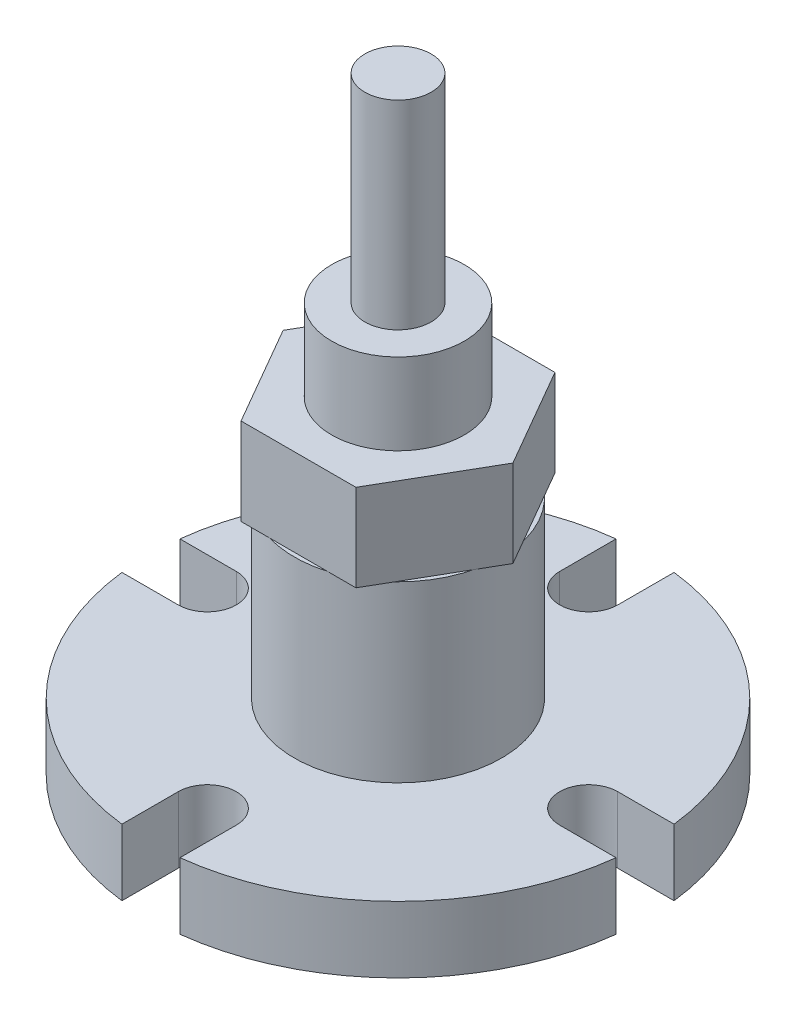
ISO-10303-21;
HEADER;
FILE_DESCRIPTION(('STEP AP214'),'2;1');
FILE_NAME('part.step','',(''),(''),'','','');
FILE_SCHEMA(('AUTOMOTIVE_DESIGN { 1 0 10303 214 1 1 1 1 }'));
ENDSEC;
DATA;
#1=APPLICATION_CONTEXT('core data for automotive mechanical design processes');
#2=APPLICATION_PROTOCOL_DEFINITION('international standard','automotive_design',2000,#1);
#3=PRODUCT_CONTEXT('',#1,'mechanical');
#4=PRODUCT('Part','Part','',(#3));
#5=PRODUCT_RELATED_PRODUCT_CATEGORY('part','',(#4));
#6=PRODUCT_DEFINITION_FORMATION('','',#4);
#7=PRODUCT_DEFINITION_CONTEXT('part definition',#1,'design');
#8=PRODUCT_DEFINITION('design','',#6,#7);
#9=PRODUCT_DEFINITION_SHAPE('','',#8);
#10=(LENGTH_UNIT() NAMED_UNIT(*) SI_UNIT(.MILLI.,.METRE.));
#11=(NAMED_UNIT(*) PLANE_ANGLE_UNIT() SI_UNIT($,.RADIAN.));
#12=(NAMED_UNIT(*) SI_UNIT($,.STERADIAN.) SOLID_ANGLE_UNIT());
#13=UNCERTAINTY_MEASURE_WITH_UNIT(LENGTH_MEASURE(1.E-05),#10,'distance_accuracy_value','');
#14=(GEOMETRIC_REPRESENTATION_CONTEXT(3) GLOBAL_UNCERTAINTY_ASSIGNED_CONTEXT((#13)) GLOBAL_UNIT_ASSIGNED_CONTEXT((#10,
#11,#12)) REPRESENTATION_CONTEXT('',''));
#15=CARTESIAN_POINT('',(0.,0.,0.));
#16=DIRECTION('',(0.,0.,1.));
#17=DIRECTION('',(1.,0.,0.));
#18=AXIS2_PLACEMENT_3D('',#15,#16,#17);
#19=CARTESIAN_POINT('',(0.,-55.3,0.));
#20=DIRECTION('',(0.,1.,0.));
#21=DIRECTION('',(0.,0.,1.));
#22=AXIS2_PLACEMENT_3D('',#19,#20,#21);
#23=CYLINDRICAL_SURFACE('',#22,15.25);
#24=CARTESIAN_POINT('',(0.,-51.3,0.));
#25=DIRECTION('',(0.,1.,0.));
#26=DIRECTION('',(0.,0.,1.));
#27=AXIS2_PLACEMENT_3D('',#24,#25,#26);
#28=CIRCLE('',#27,15.25);
#29=CARTESIAN_POINT('',(0.,-51.3,15.25));
#30=VERTEX_POINT('',#29);
#31=EDGE_CURVE('P0_E146',#30,#30,#28,.T.);
#32=ORIENTED_EDGE('',*,*,#31,.T.);
#33=EDGE_LOOP('',(#32));
#34=FACE_BOUND('',#33,.T.);
#35=CARTESIAN_POINT('',(0.,-55.3,0.));
#36=DIRECTION('',(0.,1.,0.));
#37=DIRECTION('',(0.,0.,1.));
#38=AXIS2_PLACEMENT_3D('',#35,#36,#37);
#39=CIRCLE('',#38,15.25);
#40=CARTESIAN_POINT('',(0.,-55.3,15.25));
#41=VERTEX_POINT('',#40);
#42=EDGE_CURVE('P0_E19',#41,#41,#39,.F.);
#43=ORIENTED_EDGE('',*,*,#42,.T.);
#44=EDGE_LOOP('',(#43));
#45=FACE_BOUND('',#44,.T.);
#46=ADVANCED_FACE('P0_F16',(#34,#45),#23,.F.);
#47=CARTESIAN_POINT('',(0.,-55.3,0.));
#48=DIRECTION('',(0.,1.,0.));
#49=DIRECTION('',(0.,0.,1.));
#50=AXIS2_PLACEMENT_3D('',#47,#48,#49);
#51=PLANE('',#50);
#52=DIRECTION('',(0.,0.,-1.));
#53=VECTOR('',#52,1.);
#54=CARTESIAN_POINT('',(3.49999999999976,-55.3,-23.));
#55=LINE('',#54,#53);
#56=CARTESIAN_POINT('',(3.49999999999976,-55.3,-23.));
#57=VERTEX_POINT('',#56);
#58=CARTESIAN_POINT('',(3.49999999999969,-55.3,-29.7951338308792));
#59=VERTEX_POINT('',#58);
#60=EDGE_CURVE('P0_E133',#57,#59,#55,.T.);
#61=ORIENTED_EDGE('',*,*,#60,.T.);
#62=CARTESIAN_POINT('',(0.,-55.3,0.));
#63=DIRECTION('',(0.,1.,0.));
#64=DIRECTION('',(0.,0.,1.));
#65=AXIS2_PLACEMENT_3D('',#62,#63,#64);
#66=CIRCLE('',#65,30.);
#67=CARTESIAN_POINT('',(29.7951338308792,-55.3,-3.5));
#68=VERTEX_POINT('',#67);
#69=EDGE_CURVE('P0_E216',#68,#59,#66,.T.);
#70=ORIENTED_EDGE('',*,*,#69,.F.);
#71=DIRECTION('',(-1.,0.,0.));
#72=VECTOR('',#71,1.);
#73=CARTESIAN_POINT('',(23.,-55.3,-3.5));
#74=LINE('',#73,#72);
#75=CARTESIAN_POINT('',(23.,-55.3,-3.5));
#76=VERTEX_POINT('',#75);
#77=EDGE_CURVE('P0_E158',#68,#76,#74,.T.);
#78=ORIENTED_EDGE('',*,*,#77,.T.);
#79=CARTESIAN_POINT('',(23.,-55.3,0.));
#80=DIRECTION('',(0.,-1.,0.));
#81=DIRECTION('',(0.,0.,-1.));
#82=AXIS2_PLACEMENT_3D('',#79,#80,#81);
#83=CIRCLE('',#82,3.5);
#84=CARTESIAN_POINT('',(23.,-55.3,3.5));
#85=VERTEX_POINT('',#84);
#86=EDGE_CURVE('P0_E165',#76,#85,#83,.F.);
#87=ORIENTED_EDGE('',*,*,#86,.T.);
#88=DIRECTION('',(1.,0.,0.));
#89=VECTOR('',#88,1.);
#90=CARTESIAN_POINT('',(23.,-55.3,3.5));
#91=LINE('',#90,#89);
#92=CARTESIAN_POINT('',(29.7951338308792,-55.3,3.5));
#93=VERTEX_POINT('',#92);
#94=EDGE_CURVE('P0_E162',#85,#93,#91,.T.);
#95=ORIENTED_EDGE('',*,*,#94,.T.);
#96=CARTESIAN_POINT('',(0.,-55.3,0.));
#97=DIRECTION('',(0.,1.,0.));
#98=DIRECTION('',(0.,0.,1.));
#99=AXIS2_PLACEMENT_3D('',#96,#97,#98);
#100=CIRCLE('',#99,30.);
#101=CARTESIAN_POINT('',(3.5000000000001,-55.3,29.7951338308792));
#102=VERTEX_POINT('',#101);
#103=EDGE_CURVE('P0_E219',#102,#93,#100,.T.);
#104=ORIENTED_EDGE('',*,*,#103,.F.);
#105=DIRECTION('',(0.,0.,-1.));
#106=VECTOR('',#105,1.);
#107=CARTESIAN_POINT('',(3.50000000000008,-55.3,23.));
#108=LINE('',#107,#106);
#109=CARTESIAN_POINT('',(3.50000000000008,-55.3,23.));
#110=VERTEX_POINT('',#109);
#111=EDGE_CURVE('P0_E167',#102,#110,#108,.T.);
#112=ORIENTED_EDGE('',*,*,#111,.T.);
#113=CARTESIAN_POINT('',(0.,-55.3,23.));
#114=DIRECTION('',(0.,-1.,0.));
#115=DIRECTION('',(0.,0.,-1.));
#116=AXIS2_PLACEMENT_3D('',#113,#114,#115);
#117=CIRCLE('',#116,3.5);
#118=CARTESIAN_POINT('',(-3.49999999999992,-55.3,23.));
#119=VERTEX_POINT('',#118);
#120=EDGE_CURVE('P0_E170',#110,#119,#117,.F.);
#121=ORIENTED_EDGE('',*,*,#120,.T.);
#122=DIRECTION('',(0.,0.,1.));
#123=VECTOR('',#122,1.);
#124=CARTESIAN_POINT('',(-3.49999999999992,-55.3,23.));
#125=LINE('',#124,#123);
#126=CARTESIAN_POINT('',(-3.4999999999999,-55.3,29.7951338308792));
#127=VERTEX_POINT('',#126);
#128=EDGE_CURVE('P0_E171',#119,#127,#125,.T.);
#129=ORIENTED_EDGE('',*,*,#128,.T.);
#130=CARTESIAN_POINT('',(0.,-55.3,0.));
#131=DIRECTION('',(0.,1.,0.));
#132=DIRECTION('',(0.,0.,1.));
#133=AXIS2_PLACEMENT_3D('',#130,#131,#132);
#134=CIRCLE('',#133,30.);
#135=CARTESIAN_POINT('',(-29.7951338308792,-55.3,3.5));
#136=VERTEX_POINT('',#135);
#137=EDGE_CURVE('P0_E223',#136,#127,#134,.T.);
#138=ORIENTED_EDGE('',*,*,#137,.F.);
#139=DIRECTION('',(1.,0.,0.));
#140=VECTOR('',#139,1.);
#141=CARTESIAN_POINT('',(-23.,-55.3,3.5));
#142=LINE('',#141,#140);
#143=CARTESIAN_POINT('',(-23.,-55.3,3.5));
#144=VERTEX_POINT('',#143);
#145=EDGE_CURVE('P0_E176',#136,#144,#142,.T.);
#146=ORIENTED_EDGE('',*,*,#145,.T.);
#147=CARTESIAN_POINT('',(-23.,-55.3,0.));
#148=DIRECTION('',(0.,-1.,0.));
#149=DIRECTION('',(0.,0.,-1.));
#150=AXIS2_PLACEMENT_3D('',#147,#148,#149);
#151=CIRCLE('',#150,3.5);
#152=CARTESIAN_POINT('',(-23.,-55.3,-3.5));
#153=VERTEX_POINT('',#152);
#154=EDGE_CURVE('P0_E182',#144,#153,#151,.F.);
#155=ORIENTED_EDGE('',*,*,#154,.T.);
#156=DIRECTION('',(-1.,0.,0.));
#157=VECTOR('',#156,1.);
#158=CARTESIAN_POINT('',(-23.,-55.3,-3.5));
#159=LINE('',#158,#157);
#160=CARTESIAN_POINT('',(-29.7951338308792,-55.3,-3.5));
#161=VERTEX_POINT('',#160);
#162=EDGE_CURVE('P0_E180',#153,#161,#159,.T.);
#163=ORIENTED_EDGE('',*,*,#162,.T.);
#164=CARTESIAN_POINT('',(0.,-55.3,0.));
#165=DIRECTION('',(0.,1.,0.));
#166=DIRECTION('',(0.,0.,1.));
#167=AXIS2_PLACEMENT_3D('',#164,#165,#166);
#168=CIRCLE('',#167,30.);
#169=CARTESIAN_POINT('',(-3.50000000000031,-55.3,-29.7951338308791));
#170=VERTEX_POINT('',#169);
#171=EDGE_CURVE('P0_E227',#170,#161,#168,.T.);
#172=ORIENTED_EDGE('',*,*,#171,.F.);
#173=DIRECTION('',(0.,0.,1.));
#174=VECTOR('',#173,1.);
#175=CARTESIAN_POINT('',(-3.50000000000024,-55.3,-23.));
#176=LINE('',#175,#174);
#177=CARTESIAN_POINT('',(-3.50000000000024,-55.3,-23.));
#178=VERTEX_POINT('',#177);
#179=EDGE_CURVE('P0_E126',#170,#178,#176,.T.);
#180=ORIENTED_EDGE('',*,*,#179,.T.);
#181=CARTESIAN_POINT('',(-2.40912212380176E-13,-55.3,-23.));
#182=DIRECTION('',(0.,-1.,0.));
#183=DIRECTION('',(0.,0.,-1.));
#184=AXIS2_PLACEMENT_3D('',#181,#182,#183);
#185=CIRCLE('',#184,3.5);
#186=EDGE_CURVE('P0_E128',#178,#57,#185,.F.);
#187=ORIENTED_EDGE('',*,*,#186,.T.);
#188=EDGE_LOOP('',(#61,#70,#78,#87,#95,#104,#112,#121,#129,#138,#146,#155,#163,#172,#180,#187));
#189=FACE_BOUND('',#188,.T.);
#190=ORIENTED_EDGE('',*,*,#42,.F.);
#191=EDGE_LOOP('',(#190));
#192=FACE_BOUND('',#191,.T.);
#193=ADVANCED_FACE('P0_F130',(#189,#192),#51,.F.);
#194=CARTESIAN_POINT('',(0.,-51.3,0.));
#195=DIRECTION('',(0.,1.,0.));
#196=DIRECTION('',(0.,0.,1.));
#197=AXIS2_PLACEMENT_3D('',#194,#195,#196);
#198=PLANE('',#197);
#199=ORIENTED_EDGE('',*,*,#31,.F.);
#200=EDGE_LOOP('',(#199));
#201=FACE_BOUND('',#200,.T.);
#202=CARTESIAN_POINT('',(0.,-51.3,0.));
#203=DIRECTION('',(0.,-1.,0.));
#204=DIRECTION('',(0.,0.,-1.));
#205=AXIS2_PLACEMENT_3D('',#202,#203,#204);
#206=CIRCLE('',#205,8.);
#207=CARTESIAN_POINT('',(0.,-51.3,-8.));
#208=VERTEX_POINT('',#207);
#209=EDGE_CURVE('P0_E213',#208,#208,#206,.F.);
#210=ORIENTED_EDGE('',*,*,#209,.T.);
#211=EDGE_LOOP('',(#210));
#212=FACE_BOUND('',#211,.T.);
#213=ADVANCED_FACE('P0_F236',(#201,#212),#198,.F.);
#214=CARTESIAN_POINT('',(3.49999999999976,-47.299,-23.));
#215=DIRECTION('',(1.,0.,0.));
#216=DIRECTION('',(0.,0.,-1.));
#217=AXIS2_PLACEMENT_3D('',#214,#215,#216);
#218=PLANE('',#217);
#219=DIRECTION('',(0.,-1.,0.));
#220=VECTOR('',#219,1.);
#221=CARTESIAN_POINT('',(3.49999999999976,-47.299,-23.));
#222=LINE('',#221,#220);
#223=CARTESIAN_POINT('',(3.49999999999972,-47.3,-23.));
#224=VERTEX_POINT('',#223);
#225=EDGE_CURVE('P0_E138',#57,#224,#222,.F.);
#226=ORIENTED_EDGE('',*,*,#225,.T.);
#227=DIRECTION('',(0.,0.,1.));
#228=VECTOR('',#227,1.);
#229=CARTESIAN_POINT('',(3.49999999999969,-47.3,0.));
#230=LINE('',#229,#228);
#231=CARTESIAN_POINT('',(3.49999999999969,-47.3,-29.7951338308792));
#232=VERTEX_POINT('',#231);
#233=EDGE_CURVE('P0_E212',#232,#224,#230,.T.);
#234=ORIENTED_EDGE('',*,*,#233,.F.);
#235=DIRECTION('',(0.,1.,0.));
#236=VECTOR('',#235,1.);
#237=CARTESIAN_POINT('',(3.49999999999969,-55.3,-29.7951338308792));
#238=LINE('',#237,#236);
#239=EDGE_CURVE('P0_E144',#59,#232,#238,.T.);
#240=ORIENTED_EDGE('',*,*,#239,.F.);
#241=ORIENTED_EDGE('',*,*,#60,.F.);
#242=EDGE_LOOP('',(#226,#234,#240,#241));
#243=FACE_BOUND('',#242,.T.);
#244=ADVANCED_FACE('P0_F141',(#243),#218,.F.);
#245=CARTESIAN_POINT('',(-2.40912212380176E-13,-47.299,-23.));
#246=DIRECTION('',(0.,-1.,0.));
#247=DIRECTION('',(0.,0.,-1.));
#248=AXIS2_PLACEMENT_3D('',#245,#246,#247);
#249=CYLINDRICAL_SURFACE('',#248,3.5);
#250=ORIENTED_EDGE('',*,*,#186,.F.);
#251=DIRECTION('',(0.,1.,0.));
#252=VECTOR('',#251,1.);
#253=CARTESIAN_POINT('',(-3.50000000000024,-47.299,-23.));
#254=LINE('',#253,#252);
#255=CARTESIAN_POINT('',(-3.50000000000024,-47.3,-23.));
#256=VERTEX_POINT('',#255);
#257=EDGE_CURVE('P0_E153',#178,#256,#254,.T.);
#258=ORIENTED_EDGE('',*,*,#257,.T.);
#259=CARTESIAN_POINT('',(-2.40912212380176E-13,-47.3,-23.));
#260=DIRECTION('',(0.,-1.,0.));
#261=DIRECTION('',(0.,0.,-1.));
#262=AXIS2_PLACEMENT_3D('',#259,#260,#261);
#263=CIRCLE('',#262,3.5);
#264=EDGE_CURVE('P0_E150',#224,#256,#263,.T.);
#265=ORIENTED_EDGE('',*,*,#264,.F.);
#266=ORIENTED_EDGE('',*,*,#225,.F.);
#267=EDGE_LOOP('',(#250,#258,#265,#266));
#268=FACE_BOUND('',#267,.T.);
#269=ADVANCED_FACE('P0_F148',(#268),#249,.F.);
#270=CARTESIAN_POINT('',(-3.50000000000024,-47.299,-23.));
#271=DIRECTION('',(-1.,0.,0.));
#272=DIRECTION('',(0.,0.,1.));
#273=AXIS2_PLACEMENT_3D('',#270,#271,#272);
#274=PLANE('',#273);
#275=ORIENTED_EDGE('',*,*,#257,.F.);
#276=ORIENTED_EDGE('',*,*,#179,.F.);
#277=DIRECTION('',(0.,1.,0.));
#278=VECTOR('',#277,1.);
#279=CARTESIAN_POINT('',(-3.5000000000003,-55.3,-29.7951338308791));
#280=LINE('',#279,#278);
#281=CARTESIAN_POINT('',(-3.50000000000027,-47.3,-29.7951338308791));
#282=VERTEX_POINT('',#281);
#283=EDGE_CURVE('P0_E228',#282,#170,#280,.F.);
#284=ORIENTED_EDGE('',*,*,#283,.F.);
#285=DIRECTION('',(0.,0.,1.));
#286=VECTOR('',#285,1.);
#287=CARTESIAN_POINT('',(-3.50000000000024,-47.3,0.));
#288=LINE('',#287,#286);
#289=EDGE_CURVE('P0_E210',#256,#282,#288,.F.);
#290=ORIENTED_EDGE('',*,*,#289,.F.);
#291=EDGE_LOOP('',(#275,#276,#284,#290));
#292=FACE_BOUND('',#291,.T.);
#293=ADVANCED_FACE('P0_F307',(#292),#274,.F.);
#294=CARTESIAN_POINT('',(0.,-55.3,0.));
#295=DIRECTION('',(0.,1.,0.));
#296=DIRECTION('',(0.,0.,1.));
#297=AXIS2_PLACEMENT_3D('',#294,#295,#296);
#298=CYLINDRICAL_SURFACE('',#297,30.);
#299=DIRECTION('',(0.,1.,0.));
#300=VECTOR('',#299,1.);
#301=CARTESIAN_POINT('',(-29.7951338308792,0.001000000000001,-3.5));
#302=LINE('',#301,#300);
#303=CARTESIAN_POINT('',(-29.7951338308792,-47.3,-3.5));
#304=VERTEX_POINT('',#303);
#305=EDGE_CURVE('P0_E183',#161,#304,#302,.T.);
#306=ORIENTED_EDGE('',*,*,#305,.T.);
#307=CARTESIAN_POINT('',(0.,-47.3,0.));
#308=DIRECTION('',(0.,1.,0.));
#309=DIRECTION('',(0.,0.,1.));
#310=AXIS2_PLACEMENT_3D('',#307,#308,#309);
#311=CIRCLE('',#310,30.);
#312=EDGE_CURVE('P0_E207',#282,#304,#311,.T.);
#313=ORIENTED_EDGE('',*,*,#312,.F.);
#314=ORIENTED_EDGE('',*,*,#283,.T.);
#315=ORIENTED_EDGE('',*,*,#171,.T.);
#316=EDGE_LOOP('',(#306,#313,#314,#315));
#317=FACE_BOUND('',#316,.T.);
#318=ADVANCED_FACE('P0_F303',(#317),#298,.T.);
#319=CARTESIAN_POINT('',(-23.,0.001000000000001,-3.5));
#320=DIRECTION('',(0.,0.,-1.));
#321=DIRECTION('',(-1.,0.,0.));
#322=AXIS2_PLACEMENT_3D('',#319,#320,#321);
#323=PLANE('',#322);
#324=DIRECTION('',(0.,-1.,0.));
#325=VECTOR('',#324,1.);
#326=CARTESIAN_POINT('',(-23.,0.001000000000001,-3.5));
#327=LINE('',#326,#325);
#328=CARTESIAN_POINT('',(-23.,-47.3,-3.5));
#329=VERTEX_POINT('',#328);
#330=EDGE_CURVE('P0_E179',#153,#329,#327,.F.);
#331=ORIENTED_EDGE('',*,*,#330,.T.);
#332=DIRECTION('',(1.,0.,0.));
#333=VECTOR('',#332,1.);
#334=CARTESIAN_POINT('',(0.,-47.3,-3.5));
#335=LINE('',#334,#333);
#336=EDGE_CURVE('P0_E206',#304,#329,#335,.T.);
#337=ORIENTED_EDGE('',*,*,#336,.F.);
#338=ORIENTED_EDGE('',*,*,#305,.F.);
#339=ORIENTED_EDGE('',*,*,#162,.F.);
#340=EDGE_LOOP('',(#331,#337,#338,#339));
#341=FACE_BOUND('',#340,.T.);
#342=ADVANCED_FACE('P0_F299',(#341),#323,.F.);
#343=CARTESIAN_POINT('',(-23.,0.001000000000001,0.));
#344=DIRECTION('',(0.,-1.,0.));
#345=DIRECTION('',(0.,0.,-1.));
#346=AXIS2_PLACEMENT_3D('',#343,#344,#345);
#347=CYLINDRICAL_SURFACE('',#346,3.5);
#348=ORIENTED_EDGE('',*,*,#154,.F.);
#349=DIRECTION('',(0.,1.,0.));
#350=VECTOR('',#349,1.);
#351=CARTESIAN_POINT('',(-23.,0.001000000000001,3.5));
#352=LINE('',#351,#350);
#353=CARTESIAN_POINT('',(-23.,-47.3,3.5));
#354=VERTEX_POINT('',#353);
#355=EDGE_CURVE('P0_E178',#144,#354,#352,.T.);
#356=ORIENTED_EDGE('',*,*,#355,.T.);
#357=CARTESIAN_POINT('',(-23.,-47.3,0.));
#358=DIRECTION('',(0.,-1.,0.));
#359=DIRECTION('',(0.,0.,-1.));
#360=AXIS2_PLACEMENT_3D('',#357,#358,#359);
#361=CIRCLE('',#360,3.5);
#362=EDGE_CURVE('P0_E203',#329,#354,#361,.T.);
#363=ORIENTED_EDGE('',*,*,#362,.F.);
#364=ORIENTED_EDGE('',*,*,#330,.F.);
#365=EDGE_LOOP('',(#348,#356,#363,#364));
#366=FACE_BOUND('',#365,.T.);
#367=ADVANCED_FACE('P0_F295',(#366),#347,.F.);
#368=CARTESIAN_POINT('',(-23.,0.001000000000001,3.5));
#369=DIRECTION('',(0.,0.,1.));
#370=DIRECTION('',(1.,0.,0.));
#371=AXIS2_PLACEMENT_3D('',#368,#369,#370);
#372=PLANE('',#371);
#373=ORIENTED_EDGE('',*,*,#355,.F.);
#374=ORIENTED_EDGE('',*,*,#145,.F.);
#375=DIRECTION('',(0.,1.,0.));
#376=VECTOR('',#375,1.);
#377=CARTESIAN_POINT('',(-29.7951338308792,-55.3,3.49999999999999));
#378=LINE('',#377,#376);
#379=CARTESIAN_POINT('',(-29.7951338308792,-47.3,3.5));
#380=VERTEX_POINT('',#379);
#381=EDGE_CURVE('P0_E225',#380,#136,#378,.F.);
#382=ORIENTED_EDGE('',*,*,#381,.F.);
#383=DIRECTION('',(1.,0.,0.));
#384=VECTOR('',#383,1.);
#385=CARTESIAN_POINT('',(0.,-47.3,3.5));
#386=LINE('',#385,#384);
#387=EDGE_CURVE('P0_E202',#354,#380,#386,.F.);
#388=ORIENTED_EDGE('',*,*,#387,.F.);
#389=EDGE_LOOP('',(#373,#374,#382,#388));
#390=FACE_BOUND('',#389,.T.);
#391=ADVANCED_FACE('P0_F291',(#390),#372,.F.);
#392=CARTESIAN_POINT('',(0.,-55.3,0.));
#393=DIRECTION('',(0.,1.,0.));
#394=DIRECTION('',(0.,0.,1.));
#395=AXIS2_PLACEMENT_3D('',#392,#393,#394);
#396=CYLINDRICAL_SURFACE('',#395,30.);
#397=ORIENTED_EDGE('',*,*,#381,.T.);
#398=ORIENTED_EDGE('',*,*,#137,.T.);
#399=DIRECTION('',(0.,1.,0.));
#400=VECTOR('',#399,1.);
#401=CARTESIAN_POINT('',(-3.4999999999999,-47.299,29.7951338308792));
#402=LINE('',#401,#400);
#403=CARTESIAN_POINT('',(-3.4999999999999,-47.3,29.7951338308792));
#404=VERTEX_POINT('',#403);
#405=EDGE_CURVE('P0_E175',#127,#404,#402,.T.);
#406=ORIENTED_EDGE('',*,*,#405,.T.);
#407=CARTESIAN_POINT('',(0.,-47.3,0.));
#408=DIRECTION('',(0.,1.,0.));
#409=DIRECTION('',(0.,0.,1.));
#410=AXIS2_PLACEMENT_3D('',#407,#408,#409);
#411=CIRCLE('',#410,30.);
#412=EDGE_CURVE('P0_E199',#380,#404,#411,.T.);
#413=ORIENTED_EDGE('',*,*,#412,.F.);
#414=EDGE_LOOP('',(#397,#398,#406,#413));
#415=FACE_BOUND('',#414,.T.);
#416=ADVANCED_FACE('P0_F287',(#415),#396,.T.);
#417=CARTESIAN_POINT('',(-3.49999999999992,-47.299,23.));
#418=DIRECTION('',(-1.,0.,0.));
#419=DIRECTION('',(0.,0.,1.));
#420=AXIS2_PLACEMENT_3D('',#417,#418,#419);
#421=PLANE('',#420);
#422=DIRECTION('',(0.,-1.,0.));
#423=VECTOR('',#422,1.);
#424=CARTESIAN_POINT('',(-3.49999999999992,-47.299,23.));
#425=LINE('',#424,#423);
#426=CARTESIAN_POINT('',(-3.49999999999991,-47.3,23.));
#427=VERTEX_POINT('',#426);
#428=EDGE_CURVE('P0_E174',#119,#427,#425,.F.);
#429=ORIENTED_EDGE('',*,*,#428,.T.);
#430=DIRECTION('',(0.,0.,1.));
#431=VECTOR('',#430,1.);
#432=CARTESIAN_POINT('',(-3.4999999999999,-47.3,0.));
#433=LINE('',#432,#431);
#434=EDGE_CURVE('P0_E198',#404,#427,#433,.F.);
#435=ORIENTED_EDGE('',*,*,#434,.F.);
#436=ORIENTED_EDGE('',*,*,#405,.F.);
#437=ORIENTED_EDGE('',*,*,#128,.F.);
#438=EDGE_LOOP('',(#429,#435,#436,#437));
#439=FACE_BOUND('',#438,.T.);
#440=ADVANCED_FACE('P0_F283',(#439),#421,.F.);
#441=CARTESIAN_POINT('',(0.,-47.299,23.));
#442=DIRECTION('',(0.,-1.,0.));
#443=DIRECTION('',(0.,0.,-1.));
#444=AXIS2_PLACEMENT_3D('',#441,#442,#443);
#445=CYLINDRICAL_SURFACE('',#444,3.5);
#446=DIRECTION('',(0.,1.,0.));
#447=VECTOR('',#446,1.);
#448=CARTESIAN_POINT('',(3.50000000000008,-47.299,23.));
#449=LINE('',#448,#447);
#450=CARTESIAN_POINT('',(3.50000000000008,-47.3,23.));
#451=VERTEX_POINT('',#450);
#452=EDGE_CURVE('P0_E169',#110,#451,#449,.T.);
#453=ORIENTED_EDGE('',*,*,#452,.T.);
#454=CARTESIAN_POINT('',(0.,-47.3,23.));
#455=DIRECTION('',(0.,-1.,0.));
#456=DIRECTION('',(0.,0.,-1.));
#457=AXIS2_PLACEMENT_3D('',#454,#455,#456);
#458=CIRCLE('',#457,3.5);
#459=EDGE_CURVE('P0_E196',#427,#451,#458,.T.);
#460=ORIENTED_EDGE('',*,*,#459,.F.);
#461=ORIENTED_EDGE('',*,*,#428,.F.);
#462=ORIENTED_EDGE('',*,*,#120,.F.);
#463=EDGE_LOOP('',(#453,#460,#461,#462));
#464=FACE_BOUND('',#463,.T.);
#465=ADVANCED_FACE('P0_F279',(#464),#445,.F.);
#466=CARTESIAN_POINT('',(3.50000000000008,-47.299,23.));
#467=DIRECTION('',(1.,0.,0.));
#468=DIRECTION('',(0.,0.,-1.));
#469=AXIS2_PLACEMENT_3D('',#466,#467,#468);
#470=PLANE('',#469);
#471=ORIENTED_EDGE('',*,*,#452,.F.);
#472=ORIENTED_EDGE('',*,*,#111,.F.);
#473=DIRECTION('',(0.,1.,0.));
#474=VECTOR('',#473,1.);
#475=CARTESIAN_POINT('',(3.5000000000001,-55.3,29.7951338308792));
#476=LINE('',#475,#474);
#477=CARTESIAN_POINT('',(3.50000000000009,-47.3,29.7951338308792));
#478=VERTEX_POINT('',#477);
#479=EDGE_CURVE('P0_E221',#478,#102,#476,.F.);
#480=ORIENTED_EDGE('',*,*,#479,.F.);
#481=DIRECTION('',(0.,0.,1.));
#482=VECTOR('',#481,1.);
#483=CARTESIAN_POINT('',(3.50000000000008,-47.3,0.));
#484=LINE('',#483,#482);
#485=EDGE_CURVE('P0_E195',#451,#478,#484,.T.);
#486=ORIENTED_EDGE('',*,*,#485,.F.);
#487=EDGE_LOOP('',(#471,#472,#480,#486));
#488=FACE_BOUND('',#487,.T.);
#489=ADVANCED_FACE('P0_F275',(#488),#470,.F.);
#490=CARTESIAN_POINT('',(0.,-55.3,0.));
#491=DIRECTION('',(0.,1.,0.));
#492=DIRECTION('',(0.,0.,1.));
#493=AXIS2_PLACEMENT_3D('',#490,#491,#492);
#494=CYLINDRICAL_SURFACE('',#493,30.);
#495=ORIENTED_EDGE('',*,*,#479,.T.);
#496=ORIENTED_EDGE('',*,*,#103,.T.);
#497=DIRECTION('',(0.,1.,0.));
#498=VECTOR('',#497,1.);
#499=CARTESIAN_POINT('',(29.7951338308792,-47.299,3.5));
#500=LINE('',#499,#498);
#501=CARTESIAN_POINT('',(29.7951338308792,-47.3,3.5));
#502=VERTEX_POINT('',#501);
#503=EDGE_CURVE('P0_E166',#93,#502,#500,.T.);
#504=ORIENTED_EDGE('',*,*,#503,.T.);
#505=CARTESIAN_POINT('',(0.,-47.3,0.));
#506=DIRECTION('',(0.,1.,0.));
#507=DIRECTION('',(0.,0.,1.));
#508=AXIS2_PLACEMENT_3D('',#505,#506,#507);
#509=CIRCLE('',#508,30.);
#510=EDGE_CURVE('P0_E192',#478,#502,#509,.T.);
#511=ORIENTED_EDGE('',*,*,#510,.F.);
#512=EDGE_LOOP('',(#495,#496,#504,#511));
#513=FACE_BOUND('',#512,.T.);
#514=ADVANCED_FACE('P0_F271',(#513),#494,.T.);
#515=CARTESIAN_POINT('',(23.,-47.299,3.5));
#516=DIRECTION('',(0.,0.,1.));
#517=DIRECTION('',(1.,0.,0.));
#518=AXIS2_PLACEMENT_3D('',#515,#516,#517);
#519=PLANE('',#518);
#520=DIRECTION('',(0.,-1.,0.));
#521=VECTOR('',#520,1.);
#522=CARTESIAN_POINT('',(23.,-47.299,3.5));
#523=LINE('',#522,#521);
#524=CARTESIAN_POINT('',(23.,-47.3,3.5));
#525=VERTEX_POINT('',#524);
#526=EDGE_CURVE('P0_E160',#85,#525,#523,.F.);
#527=ORIENTED_EDGE('',*,*,#526,.T.);
#528=DIRECTION('',(1.,0.,0.));
#529=VECTOR('',#528,1.);
#530=CARTESIAN_POINT('',(0.,-47.3,3.5));
#531=LINE('',#530,#529);
#532=EDGE_CURVE('P0_E191',#502,#525,#531,.F.);
#533=ORIENTED_EDGE('',*,*,#532,.F.);
#534=ORIENTED_EDGE('',*,*,#503,.F.);
#535=ORIENTED_EDGE('',*,*,#94,.F.);
#536=EDGE_LOOP('',(#527,#533,#534,#535));
#537=FACE_BOUND('',#536,.T.);
#538=ADVANCED_FACE('P0_F267',(#537),#519,.F.);
#539=CARTESIAN_POINT('',(23.,-47.299,0.));
#540=DIRECTION('',(0.,-1.,0.));
#541=DIRECTION('',(0.,0.,-1.));
#542=AXIS2_PLACEMENT_3D('',#539,#540,#541);
#543=CYLINDRICAL_SURFACE('',#542,3.5);
#544=ORIENTED_EDGE('',*,*,#86,.F.);
#545=DIRECTION('',(0.,1.,0.));
#546=VECTOR('',#545,1.);
#547=CARTESIAN_POINT('',(23.,-47.299,-3.5));
#548=LINE('',#547,#546);
#549=CARTESIAN_POINT('',(23.,-47.3,-3.5));
#550=VERTEX_POINT('',#549);
#551=EDGE_CURVE('P0_E159',#76,#550,#548,.T.);
#552=ORIENTED_EDGE('',*,*,#551,.T.);
#553=CARTESIAN_POINT('',(23.,-47.3,0.));
#554=DIRECTION('',(0.,-1.,0.));
#555=DIRECTION('',(0.,0.,-1.));
#556=AXIS2_PLACEMENT_3D('',#553,#554,#555);
#557=CIRCLE('',#556,3.5);
#558=EDGE_CURVE('P0_E188',#525,#550,#557,.T.);
#559=ORIENTED_EDGE('',*,*,#558,.F.);
#560=ORIENTED_EDGE('',*,*,#526,.F.);
#561=EDGE_LOOP('',(#544,#552,#559,#560));
#562=FACE_BOUND('',#561,.T.);
#563=ADVANCED_FACE('P0_F264',(#562),#543,.F.);
#564=CARTESIAN_POINT('',(23.,-47.299,-3.5));
#565=DIRECTION('',(0.,0.,-1.));
#566=DIRECTION('',(-1.,0.,0.));
#567=AXIS2_PLACEMENT_3D('',#564,#565,#566);
#568=PLANE('',#567);
#569=ORIENTED_EDGE('',*,*,#551,.F.);
#570=ORIENTED_EDGE('',*,*,#77,.F.);
#571=DIRECTION('',(0.,1.,0.));
#572=VECTOR('',#571,1.);
#573=CARTESIAN_POINT('',(29.7951338308792,-55.3,-3.5));
#574=LINE('',#573,#572);
#575=CARTESIAN_POINT('',(29.7951338308792,-47.3,-3.5));
#576=VERTEX_POINT('',#575);
#577=EDGE_CURVE('P0_E34',#576,#68,#574,.F.);
#578=ORIENTED_EDGE('',*,*,#577,.F.);
#579=DIRECTION('',(1.,0.,0.));
#580=VECTOR('',#579,1.);
#581=CARTESIAN_POINT('',(0.,-47.3,-3.5));
#582=LINE('',#581,#580);
#583=EDGE_CURVE('P0_E187',#550,#576,#582,.T.);
#584=ORIENTED_EDGE('',*,*,#583,.F.);
#585=EDGE_LOOP('',(#569,#570,#578,#584));
#586=FACE_BOUND('',#585,.T.);
#587=ADVANCED_FACE('P0_F260',(#586),#568,.F.);
#588=CARTESIAN_POINT('',(0.,-55.3,0.));
#589=DIRECTION('',(0.,1.,0.));
#590=DIRECTION('',(0.,0.,1.));
#591=AXIS2_PLACEMENT_3D('',#588,#589,#590);
#592=CYLINDRICAL_SURFACE('',#591,30.);
#593=ORIENTED_EDGE('',*,*,#577,.T.);
#594=ORIENTED_EDGE('',*,*,#69,.T.);
#595=ORIENTED_EDGE('',*,*,#239,.T.);
#596=CARTESIAN_POINT('',(0.,-47.3,0.));
#597=DIRECTION('',(0.,1.,0.));
#598=DIRECTION('',(0.,0.,1.));
#599=AXIS2_PLACEMENT_3D('',#596,#597,#598);
#600=CIRCLE('',#599,30.);
#601=EDGE_CURVE('P0_E25',#576,#232,#600,.T.);
#602=ORIENTED_EDGE('',*,*,#601,.F.);
#603=EDGE_LOOP('',(#593,#594,#595,#602));
#604=FACE_BOUND('',#603,.T.);
#605=ADVANCED_FACE('P0_F253',(#604),#592,.T.);
#606=CARTESIAN_POINT('',(0.,-47.3,0.));
#607=DIRECTION('',(0.,-1.,0.));
#608=DIRECTION('',(0.,0.,-1.));
#609=AXIS2_PLACEMENT_3D('',#606,#607,#608);
#610=CYLINDRICAL_SURFACE('',#609,8.);
#611=CARTESIAN_POINT('',(0.,-47.3,0.));
#612=DIRECTION('',(0.,-1.,0.));
#613=DIRECTION('',(0.,0.,-1.));
#614=AXIS2_PLACEMENT_3D('',#611,#612,#613);
#615=CIRCLE('',#614,8.);
#616=CARTESIAN_POINT('',(0.,-47.3,-8.));
#617=VERTEX_POINT('',#616);
#618=EDGE_CURVE('P0_E11',#617,#617,#615,.T.);
#619=ORIENTED_EDGE('',*,*,#618,.F.);
#620=EDGE_LOOP('',(#619));
#621=FACE_BOUND('',#620,.T.);
#622=ORIENTED_EDGE('',*,*,#209,.F.);
#623=EDGE_LOOP('',(#622));
#624=FACE_BOUND('',#623,.T.);
#625=ADVANCED_FACE('P0_F247',(#621,#624),#610,.F.);
#626=CARTESIAN_POINT('',(0.,-47.3,0.));
#627=DIRECTION('',(0.,1.,0.));
#628=DIRECTION('',(0.,0.,1.));
#629=AXIS2_PLACEMENT_3D('',#626,#627,#628);
#630=PLANE('',#629);
#631=ORIENTED_EDGE('',*,*,#618,.T.);
#632=EDGE_LOOP('',(#631));
#633=FACE_BOUND('',#632,.T.);
#634=ORIENTED_EDGE('',*,*,#583,.T.);
#635=ORIENTED_EDGE('',*,*,#601,.T.);
#636=ORIENTED_EDGE('',*,*,#233,.T.);
#637=ORIENTED_EDGE('',*,*,#264,.T.);
#638=ORIENTED_EDGE('',*,*,#289,.T.);
#639=ORIENTED_EDGE('',*,*,#312,.T.);
#640=ORIENTED_EDGE('',*,*,#336,.T.);
#641=ORIENTED_EDGE('',*,*,#362,.T.);
#642=ORIENTED_EDGE('',*,*,#387,.T.);
#643=ORIENTED_EDGE('',*,*,#412,.T.);
#644=ORIENTED_EDGE('',*,*,#434,.T.);
#645=ORIENTED_EDGE('',*,*,#459,.T.);
#646=ORIENTED_EDGE('',*,*,#485,.T.);
#647=ORIENTED_EDGE('',*,*,#510,.T.);
#648=ORIENTED_EDGE('',*,*,#532,.T.);
#649=ORIENTED_EDGE('',*,*,#558,.T.);
#650=EDGE_LOOP('',(#634,#635,#636,#637,#638,#639,#640,#641,#642,#643,#644,#645,#646,#647,#648,#649));
#651=FACE_BOUND('',#650,.T.);
#652=ADVANCED_FACE('P0_F245',(#633,#651),#630,.T.);
#653=CLOSED_SHELL('',(#46,#193,#213,#244,#269,#293,#318,#342,#367,#391,#416,#440,#465,#489,#514,
#538,#563,#587,#605,#625,#652));
#654=MANIFOLD_SOLID_BREP('P0_B1',#653);
#655=CARTESIAN_POINT('',(0.,-15.8,0.));
#656=DIRECTION('',(0.,1.,0.));
#657=DIRECTION('',(0.,0.,1.));
#658=AXIS2_PLACEMENT_3D('',#655,#656,#657);
#659=PLANE('',#658);
#660=CARTESIAN_POINT('',(0.,-15.8,0.));
#661=DIRECTION('',(0.,-1.,0.));
#662=DIRECTION('',(0.,0.,-1.));
#663=AXIS2_PLACEMENT_3D('',#660,#661,#662);
#664=CIRCLE('',#663,8.);
#665=CARTESIAN_POINT('',(0.,-15.8,-8.));
#666=VERTEX_POINT('',#665);
#667=EDGE_CURVE('P1_E19',#666,#666,#664,.T.);
#668=ORIENTED_EDGE('',*,*,#667,.T.);
#669=EDGE_LOOP('',(#668));
#670=FACE_BOUND('',#669,.T.);
#671=DIRECTION('',(-1.,0.,0.));
#672=VECTOR('',#671,1.);
#673=CARTESIAN_POINT('',(-6.92820323027551,-15.8,12.));
#674=LINE('',#673,#672);
#675=CARTESIAN_POINT('',(-6.92820323027551,-15.8,12.));
#676=VERTEX_POINT('',#675);
#677=CARTESIAN_POINT('',(6.92820323027551,-15.8,12.));
#678=VERTEX_POINT('',#677);
#679=EDGE_CURVE('P1_E95',#676,#678,#674,.F.);
#680=ORIENTED_EDGE('',*,*,#679,.T.);
#681=DIRECTION('',(-0.5,0.,0.866025403784439));
#682=VECTOR('',#681,1.);
#683=CARTESIAN_POINT('',(6.92820323027551,-15.8,12.));
#684=LINE('',#683,#682);
#685=CARTESIAN_POINT('',(13.856406460551,-15.8,0.));
#686=VERTEX_POINT('',#685);
#687=EDGE_CURVE('P1_E100',#678,#686,#684,.F.);
#688=ORIENTED_EDGE('',*,*,#687,.T.);
#689=DIRECTION('',(0.5,0.,0.866025403784439));
#690=VECTOR('',#689,1.);
#691=CARTESIAN_POINT('',(13.856406460551,-15.8,0.));
#692=LINE('',#691,#690);
#693=CARTESIAN_POINT('',(6.92820323027551,-15.8,-12.));
#694=VERTEX_POINT('',#693);
#695=EDGE_CURVE('P1_E70',#686,#694,#692,.F.);
#696=ORIENTED_EDGE('',*,*,#695,.T.);
#697=DIRECTION('',(1.,0.,0.));
#698=VECTOR('',#697,1.);
#699=CARTESIAN_POINT('',(6.92820323027551,-15.8,-12.));
#700=LINE('',#699,#698);
#701=CARTESIAN_POINT('',(-6.92820323027551,-15.8,-12.));
#702=VERTEX_POINT('',#701);
#703=EDGE_CURVE('P1_E69',#694,#702,#700,.F.);
#704=ORIENTED_EDGE('',*,*,#703,.T.);
#705=DIRECTION('',(0.5,0.,-0.866025403784439));
#706=VECTOR('',#705,1.);
#707=CARTESIAN_POINT('',(-6.92820323027551,-15.8,-12.));
#708=LINE('',#707,#706);
#709=CARTESIAN_POINT('',(-13.856406460551,-15.8,0.));
#710=VERTEX_POINT('',#709);
#711=EDGE_CURVE('P1_E66',#702,#710,#708,.F.);
#712=ORIENTED_EDGE('',*,*,#711,.T.);
#713=DIRECTION('',(-0.5,0.,-0.866025403784439));
#714=VECTOR('',#713,1.);
#715=CARTESIAN_POINT('',(-13.856406460551,-15.8,0.));
#716=LINE('',#715,#714);
#717=EDGE_CURVE('P1_E90',#710,#676,#716,.F.);
#718=ORIENTED_EDGE('',*,*,#717,.T.);
#719=EDGE_LOOP('',(#680,#688,#696,#704,#712,#718));
#720=FACE_BOUND('',#719,.T.);
#721=ADVANCED_FACE('P1_F16',(#670,#720),#659,.T.);
#722=CARTESIAN_POINT('',(6.92820323027551,-15.8,-12.));
#723=DIRECTION('',(0.,0.,1.));
#724=DIRECTION('',(1.,0.,0.));
#725=AXIS2_PLACEMENT_3D('',#722,#723,#724);
#726=PLANE('',#725);
#727=DIRECTION('',(0.,1.,0.));
#728=VECTOR('',#727,1.);
#729=CARTESIAN_POINT('',(-6.92820323027551,-15.8,-12.));
#730=LINE('',#729,#728);
#731=CARTESIAN_POINT('',(-6.92820323027551,-26.3,-12.));
#732=VERTEX_POINT('',#731);
#733=EDGE_CURVE('P1_E75',#732,#702,#730,.T.);
#734=ORIENTED_EDGE('',*,*,#733,.T.);
#735=ORIENTED_EDGE('',*,*,#703,.F.);
#736=DIRECTION('',(0.,1.,0.));
#737=VECTOR('',#736,1.);
#738=CARTESIAN_POINT('',(6.92820323027551,-15.8,-12.));
#739=LINE('',#738,#737);
#740=CARTESIAN_POINT('',(6.92820323027551,-26.3,-12.));
#741=VERTEX_POINT('',#740);
#742=EDGE_CURVE('P1_E104',#694,#741,#739,.F.);
#743=ORIENTED_EDGE('',*,*,#742,.T.);
#744=DIRECTION('',(1.,0.,0.));
#745=VECTOR('',#744,1.);
#746=CARTESIAN_POINT('',(0.,-26.3,-12.));
#747=LINE('',#746,#745);
#748=EDGE_CURVE('P1_E86',#741,#732,#747,.F.);
#749=ORIENTED_EDGE('',*,*,#748,.T.);
#750=EDGE_LOOP('',(#734,#735,#743,#749));
#751=FACE_BOUND('',#750,.T.);
#752=ADVANCED_FACE('P1_F85',(#751),#726,.F.);
#753=CARTESIAN_POINT('',(-6.92820323027551,-15.8,-12.));
#754=DIRECTION('',(0.866025403784439,0.,0.5));
#755=DIRECTION('',(0.5,0.,-0.866025403784439));
#756=AXIS2_PLACEMENT_3D('',#753,#754,#755);
#757=PLANE('',#756);
#758=DIRECTION('',(0.,1.,0.));
#759=VECTOR('',#758,1.);
#760=CARTESIAN_POINT('',(-13.856406460551,-15.8,0.));
#761=LINE('',#760,#759);
#762=CARTESIAN_POINT('',(-13.856406460551,-26.3,0.));
#763=VERTEX_POINT('',#762);
#764=EDGE_CURVE('P1_E82',#763,#710,#761,.T.);
#765=ORIENTED_EDGE('',*,*,#764,.T.);
#766=ORIENTED_EDGE('',*,*,#711,.F.);
#767=ORIENTED_EDGE('',*,*,#733,.F.);
#768=DIRECTION('',(-0.5,0.,0.866025403784439));
#769=VECTOR('',#768,1.);
#770=CARTESIAN_POINT('',(-6.92820323027551,-26.3,-12.));
#771=LINE('',#770,#769);
#772=EDGE_CURVE('P1_E107',#732,#763,#771,.T.);
#773=ORIENTED_EDGE('',*,*,#772,.T.);
#774=EDGE_LOOP('',(#765,#766,#767,#773));
#775=FACE_BOUND('',#774,.T.);
#776=ADVANCED_FACE('P1_F79',(#775),#757,.F.);
#777=CARTESIAN_POINT('',(-13.856406460551,-15.8,0.));
#778=DIRECTION('',(0.866025403784439,0.,-0.5));
#779=DIRECTION('',(-0.5,0.,-0.866025403784439));
#780=AXIS2_PLACEMENT_3D('',#777,#778,#779);
#781=PLANE('',#780);
#782=DIRECTION('',(0.,1.,0.));
#783=VECTOR('',#782,1.);
#784=CARTESIAN_POINT('',(-6.92820323027551,-15.8,12.));
#785=LINE('',#784,#783);
#786=CARTESIAN_POINT('',(-6.92820323027551,-26.3,12.));
#787=VERTEX_POINT('',#786);
#788=EDGE_CURVE('P1_E92',#787,#676,#785,.T.);
#789=ORIENTED_EDGE('',*,*,#788,.T.);
#790=ORIENTED_EDGE('',*,*,#717,.F.);
#791=ORIENTED_EDGE('',*,*,#764,.F.);
#792=DIRECTION('',(0.5,0.,0.866025403784438));
#793=VECTOR('',#792,1.);
#794=CARTESIAN_POINT('',(-13.856406460551,-26.3,0.));
#795=LINE('',#794,#793);
#796=EDGE_CURVE('P1_E109',#763,#787,#795,.T.);
#797=ORIENTED_EDGE('',*,*,#796,.T.);
#798=EDGE_LOOP('',(#789,#790,#791,#797));
#799=FACE_BOUND('',#798,.T.);
#800=ADVANCED_FACE('P1_F131',(#799),#781,.F.);
#801=CARTESIAN_POINT('',(-6.92820323027551,-15.8,12.));
#802=DIRECTION('',(0.,0.,-1.));
#803=DIRECTION('',(-1.,0.,0.));
#804=AXIS2_PLACEMENT_3D('',#801,#802,#803);
#805=PLANE('',#804);
#806=DIRECTION('',(0.,1.,0.));
#807=VECTOR('',#806,1.);
#808=CARTESIAN_POINT('',(6.92820323027551,-15.8,12.));
#809=LINE('',#808,#807);
#810=CARTESIAN_POINT('',(6.92820323027551,-26.3,12.));
#811=VERTEX_POINT('',#810);
#812=EDGE_CURVE('P1_E97',#811,#678,#809,.T.);
#813=ORIENTED_EDGE('',*,*,#812,.T.);
#814=ORIENTED_EDGE('',*,*,#679,.F.);
#815=ORIENTED_EDGE('',*,*,#788,.F.);
#816=DIRECTION('',(1.,0.,0.));
#817=VECTOR('',#816,1.);
#818=CARTESIAN_POINT('',(0.,-26.3,12.));
#819=LINE('',#818,#817);
#820=EDGE_CURVE('P1_E112',#787,#811,#819,.T.);
#821=ORIENTED_EDGE('',*,*,#820,.T.);
#822=EDGE_LOOP('',(#813,#814,#815,#821));
#823=FACE_BOUND('',#822,.T.);
#824=ADVANCED_FACE('P1_F128',(#823),#805,.F.);
#825=CARTESIAN_POINT('',(6.92820323027551,-15.8,12.));
#826=DIRECTION('',(-0.866025403784439,0.,-0.5));
#827=DIRECTION('',(-0.5,0.,0.866025403784439));
#828=AXIS2_PLACEMENT_3D('',#825,#826,#827);
#829=PLANE('',#828);
#830=DIRECTION('',(0.,1.,0.));
#831=VECTOR('',#830,1.);
#832=CARTESIAN_POINT('',(13.856406460551,-15.8,0.));
#833=LINE('',#832,#831);
#834=CARTESIAN_POINT('',(13.856406460551,-26.3,0.));
#835=VERTEX_POINT('',#834);
#836=EDGE_CURVE('P1_E33',#835,#686,#833,.T.);
#837=ORIENTED_EDGE('',*,*,#836,.T.);
#838=ORIENTED_EDGE('',*,*,#687,.F.);
#839=ORIENTED_EDGE('',*,*,#812,.F.);
#840=DIRECTION('',(0.5,0.,-0.866025403784439));
#841=VECTOR('',#840,1.);
#842=CARTESIAN_POINT('',(6.92820323027551,-26.3,12.));
#843=LINE('',#842,#841);
#844=EDGE_CURVE('P1_E115',#811,#835,#843,.T.);
#845=ORIENTED_EDGE('',*,*,#844,.T.);
#846=EDGE_LOOP('',(#837,#838,#839,#845));
#847=FACE_BOUND('',#846,.T.);
#848=ADVANCED_FACE('P1_F124',(#847),#829,.F.);
#849=CARTESIAN_POINT('',(13.856406460551,-15.8,0.));
#850=DIRECTION('',(-0.866025403784439,0.,0.5));
#851=DIRECTION('',(0.5,0.,0.866025403784439));
#852=AXIS2_PLACEMENT_3D('',#849,#850,#851);
#853=PLANE('',#852);
#854=ORIENTED_EDGE('',*,*,#742,.F.);
#855=ORIENTED_EDGE('',*,*,#695,.F.);
#856=ORIENTED_EDGE('',*,*,#836,.F.);
#857=DIRECTION('',(-0.5,0.,-0.866025403784438));
#858=VECTOR('',#857,1.);
#859=CARTESIAN_POINT('',(13.856406460551,-26.3,0.));
#860=LINE('',#859,#858);
#861=EDGE_CURVE('P1_E25',#835,#741,#860,.T.);
#862=ORIENTED_EDGE('',*,*,#861,.T.);
#863=EDGE_LOOP('',(#854,#855,#856,#862));
#864=FACE_BOUND('',#863,.T.);
#865=ADVANCED_FACE('P1_F118',(#864),#853,.F.);
#866=CARTESIAN_POINT('',(0.,-15.8,0.));
#867=DIRECTION('',(0.,-1.,0.));
#868=DIRECTION('',(0.,0.,-1.));
#869=AXIS2_PLACEMENT_3D('',#866,#867,#868);
#870=CYLINDRICAL_SURFACE('',#869,8.);
#871=CARTESIAN_POINT('',(0.,-26.3,0.));
#872=DIRECTION('',(0.,-1.,0.));
#873=DIRECTION('',(0.,0.,-1.));
#874=AXIS2_PLACEMENT_3D('',#871,#872,#873);
#875=CIRCLE('',#874,8.);
#876=CARTESIAN_POINT('',(0.,-26.3,-8.));
#877=VERTEX_POINT('',#876);
#878=EDGE_CURVE('P1_E11',#877,#877,#875,.T.);
#879=ORIENTED_EDGE('',*,*,#878,.T.);
#880=EDGE_LOOP('',(#879));
#881=FACE_BOUND('',#880,.T.);
#882=ORIENTED_EDGE('',*,*,#667,.F.);
#883=EDGE_LOOP('',(#882));
#884=FACE_BOUND('',#883,.T.);
#885=ADVANCED_FACE('P1_F142',(#881,#884),#870,.F.);
#886=CARTESIAN_POINT('',(0.,-26.3,0.));
#887=DIRECTION('',(0.,1.,0.));
#888=DIRECTION('',(0.,0.,1.));
#889=AXIS2_PLACEMENT_3D('',#886,#887,#888);
#890=PLANE('',#889);
#891=ORIENTED_EDGE('',*,*,#878,.F.);
#892=EDGE_LOOP('',(#891));
#893=FACE_BOUND('',#892,.T.);
#894=ORIENTED_EDGE('',*,*,#844,.F.);
#895=ORIENTED_EDGE('',*,*,#820,.F.);
#896=ORIENTED_EDGE('',*,*,#796,.F.);
#897=ORIENTED_EDGE('',*,*,#772,.F.);
#898=ORIENTED_EDGE('',*,*,#748,.F.);
#899=ORIENTED_EDGE('',*,*,#861,.F.);
#900=EDGE_LOOP('',(#894,#895,#896,#897,#898,#899));
#901=FACE_BOUND('',#900,.T.);
#902=ADVANCED_FACE('P1_F121',(#893,#901),#890,.F.);
#903=CLOSED_SHELL('',(#721,#752,#776,#800,#824,#848,#865,#885,#902));
#904=MANIFOLD_SOLID_BREP('P1_B1',#903);
#905=CARTESIAN_POINT('',(0.,-56.8,0.));
#906=DIRECTION('',(0.,-1.,0.));
#907=DIRECTION('',(0.,0.,-1.));
#908=AXIS2_PLACEMENT_3D('',#905,#906,#907);
#909=PLANE('',#908);
#910=CARTESIAN_POINT('',(0.,-56.8,0.));
#911=DIRECTION('',(0.,-1.,0.));
#912=DIRECTION('',(0.,0.,-1.));
#913=AXIS2_PLACEMENT_3D('',#910,#911,#912);
#914=CIRCLE('',#913,15.25);
#915=CARTESIAN_POINT('',(0.,-56.8,-15.25));
#916=VERTEX_POINT('',#915);
#917=EDGE_CURVE('P2_E33',#916,#916,#914,.F.);
#918=ORIENTED_EDGE('',*,*,#917,.F.);
#919=EDGE_LOOP('',(#918));
#920=FACE_BOUND('',#919,.T.);
#921=CARTESIAN_POINT('',(0.,-56.8,0.));
#922=DIRECTION('',(0.,1.,0.));
#923=DIRECTION('',(0.,0.,1.));
#924=AXIS2_PLACEMENT_3D('',#921,#922,#923);
#925=CIRCLE('',#924,8.1);
#926=CARTESIAN_POINT('',(0.,-56.8,8.1));
#927=VERTEX_POINT('',#926);
#928=EDGE_CURVE('P2_E17',#927,#927,#925,.T.);
#929=ORIENTED_EDGE('',*,*,#928,.T.);
#930=EDGE_LOOP('',(#929));
#931=FACE_BOUND('',#930,.T.);
#932=ADVANCED_FACE('P2_F14',(#920,#931),#909,.T.);
#933=CARTESIAN_POINT('',(0.,-56.8,0.));
#934=DIRECTION('',(0.,1.,0.));
#935=DIRECTION('',(0.,0.,1.));
#936=AXIS2_PLACEMENT_3D('',#933,#934,#935);
#937=CYLINDRICAL_SURFACE('',#936,8.1);
#938=CARTESIAN_POINT('',(0.,-26.3,0.));
#939=DIRECTION('',(0.,1.,0.));
#940=DIRECTION('',(0.,0.,1.));
#941=AXIS2_PLACEMENT_3D('',#938,#939,#940);
#942=CIRCLE('',#941,8.1);
#943=CARTESIAN_POINT('',(0.,-26.3,8.1));
#944=VERTEX_POINT('',#943);
#945=EDGE_CURVE('P2_E31',#944,#944,#942,.F.);
#946=ORIENTED_EDGE('',*,*,#945,.F.);
#947=EDGE_LOOP('',(#946));
#948=FACE_BOUND('',#947,.T.);
#949=ORIENTED_EDGE('',*,*,#928,.F.);
#950=EDGE_LOOP('',(#949));
#951=FACE_BOUND('',#950,.T.);
#952=ADVANCED_FACE('P2_F41',(#948,#951),#937,.F.);
#953=CARTESIAN_POINT('',(0.,-51.3,0.));
#954=DIRECTION('',(0.,-1.,0.));
#955=DIRECTION('',(0.,0.,-1.));
#956=AXIS2_PLACEMENT_3D('',#953,#954,#955);
#957=CYLINDRICAL_SURFACE('',#956,15.25);
#958=ORIENTED_EDGE('',*,*,#917,.T.);
#959=EDGE_LOOP('',(#958));
#960=FACE_BOUND('',#959,.T.);
#961=CARTESIAN_POINT('',(0.,-51.3,0.));
#962=DIRECTION('',(0.,-1.,0.));
#963=DIRECTION('',(0.,0.,-1.));
#964=AXIS2_PLACEMENT_3D('',#961,#962,#963);
#965=CIRCLE('',#964,15.25);
#966=CARTESIAN_POINT('',(0.,-51.3,-15.25));
#967=VERTEX_POINT('',#966);
#968=EDGE_CURVE('P2_E26',#967,#967,#965,.T.);
#969=ORIENTED_EDGE('',*,*,#968,.T.);
#970=EDGE_LOOP('',(#969));
#971=FACE_BOUND('',#970,.T.);
#972=ADVANCED_FACE('P2_F43',(#960,#971),#957,.T.);
#973=CARTESIAN_POINT('',(0.,-26.3,0.));
#974=DIRECTION('',(0.,1.,0.));
#975=DIRECTION('',(0.,0.,1.));
#976=AXIS2_PLACEMENT_3D('',#973,#974,#975);
#977=PLANE('',#976);
#978=CARTESIAN_POINT('',(0.,-26.3,0.));
#979=DIRECTION('',(0.,-1.,0.));
#980=DIRECTION('',(0.,0.,-1.));
#981=AXIS2_PLACEMENT_3D('',#978,#979,#980);
#982=CIRCLE('',#981,12.5);
#983=CARTESIAN_POINT('',(0.,-26.3,-12.5));
#984=VERTEX_POINT('',#983);
#985=EDGE_CURVE('P2_E21',#984,#984,#982,.T.);
#986=ORIENTED_EDGE('',*,*,#985,.F.);
#987=EDGE_LOOP('',(#986));
#988=FACE_BOUND('',#987,.T.);
#989=ORIENTED_EDGE('',*,*,#945,.T.);
#990=EDGE_LOOP('',(#989));
#991=FACE_BOUND('',#990,.T.);
#992=ADVANCED_FACE('P2_F50',(#988,#991),#977,.T.);
#993=CARTESIAN_POINT('',(0.,-51.3,0.));
#994=DIRECTION('',(0.,-1.,0.));
#995=DIRECTION('',(0.,0.,-1.));
#996=AXIS2_PLACEMENT_3D('',#993,#994,#995);
#997=PLANE('',#996);
#998=CARTESIAN_POINT('',(0.,-51.3,0.));
#999=DIRECTION('',(0.,-1.,0.));
#1000=DIRECTION('',(0.,0.,-1.));
#1001=AXIS2_PLACEMENT_3D('',#998,#999,#1000);
#1002=CIRCLE('',#1001,12.5);
#1003=CARTESIAN_POINT('',(0.,-51.3,-12.5));
#1004=VERTEX_POINT('',#1003);
#1005=EDGE_CURVE('P2_E10',#1004,#1004,#1002,.F.);
#1006=ORIENTED_EDGE('',*,*,#1005,.F.);
#1007=EDGE_LOOP('',(#1006));
#1008=FACE_BOUND('',#1007,.T.);
#1009=ORIENTED_EDGE('',*,*,#968,.F.);
#1010=EDGE_LOOP('',(#1009));
#1011=FACE_BOUND('',#1010,.T.);
#1012=ADVANCED_FACE('P2_F56',(#1008,#1011),#997,.F.);
#1013=CARTESIAN_POINT('',(0.,-26.3,0.));
#1014=DIRECTION('',(0.,-1.,0.));
#1015=DIRECTION('',(0.,0.,-1.));
#1016=AXIS2_PLACEMENT_3D('',#1013,#1014,#1015);
#1017=CYLINDRICAL_SURFACE('',#1016,12.5);
#1018=ORIENTED_EDGE('',*,*,#1005,.T.);
#1019=EDGE_LOOP('',(#1018));
#1020=FACE_BOUND('',#1019,.T.);
#1021=ORIENTED_EDGE('',*,*,#985,.T.);
#1022=EDGE_LOOP('',(#1021));
#1023=FACE_BOUND('',#1022,.T.);
#1024=ADVANCED_FACE('P2_F54',(#1020,#1023),#1017,.T.);
#1025=CLOSED_SHELL('',(#932,#952,#972,#992,#1012,#1024));
#1026=MANIFOLD_SOLID_BREP('P2_B1',#1025);
#1027=CARTESIAN_POINT('',(0.,18.,0.));
#1028=DIRECTION('',(0.,1.,0.));
#1029=DIRECTION('',(0.,0.,1.));
#1030=AXIS2_PLACEMENT_3D('',#1027,#1028,#1029);
#1031=PLANE('',#1030);
#1032=CARTESIAN_POINT('',(0.,18.,0.));
#1033=DIRECTION('',(0.,-1.,0.));
#1034=DIRECTION('',(0.,0.,-1.));
#1035=AXIS2_PLACEMENT_3D('',#1032,#1033,#1034);
#1036=CIRCLE('',#1035,4.);
#1037=CARTESIAN_POINT('',(0.,18.,-4.));
#1038=VERTEX_POINT('',#1037);
#1039=EDGE_CURVE('P3_E17',#1038,#1038,#1036,.T.);
#1040=ORIENTED_EDGE('',*,*,#1039,.F.);
#1041=EDGE_LOOP('',(#1040));
#1042=FACE_BOUND('',#1041,.T.);
#1043=ADVANCED_FACE('P3_F14',(#1042),#1031,.T.);
#1044=CARTESIAN_POINT('',(0.,18.,0.));
#1045=DIRECTION('',(0.,-1.,0.));
#1046=DIRECTION('',(0.,0.,-1.));
#1047=AXIS2_PLACEMENT_3D('',#1044,#1045,#1046);
#1048=CYLINDRICAL_SURFACE('',#1047,4.);
#1049=ORIENTED_EDGE('',*,*,#1039,.T.);
#1050=EDGE_LOOP('',(#1049));
#1051=FACE_BOUND('',#1050,.T.);
#1052=CARTESIAN_POINT('',(0.,-6.,0.));
#1053=DIRECTION('',(0.,-1.,0.));
#1054=DIRECTION('',(0.,0.,-1.));
#1055=AXIS2_PLACEMENT_3D('',#1052,#1053,#1054);
#1056=CIRCLE('',#1055,4.);
#1057=CARTESIAN_POINT('',(0.,-6.,-4.));
#1058=VERTEX_POINT('',#1057);
#1059=EDGE_CURVE('P3_E26',#1058,#1058,#1056,.F.);
#1060=ORIENTED_EDGE('',*,*,#1059,.T.);
#1061=EDGE_LOOP('',(#1060));
#1062=FACE_BOUND('',#1061,.T.);
#1063=ADVANCED_FACE('P3_F34',(#1051,#1062),#1048,.T.);
#1064=CARTESIAN_POINT('',(0.,-48.8,0.));
#1065=DIRECTION('',(0.,-1.,0.));
#1066=DIRECTION('',(0.,0.,-1.));
#1067=AXIS2_PLACEMENT_3D('',#1064,#1065,#1066);
#1068=PLANE('',#1067);
#1069=CARTESIAN_POINT('',(0.,-48.8,0.));
#1070=DIRECTION('',(0.,1.,0.));
#1071=DIRECTION('',(0.,0.,1.));
#1072=AXIS2_PLACEMENT_3D('',#1069,#1070,#1071);
#1073=CIRCLE('',#1072,8.);
#1074=CARTESIAN_POINT('',(0.,-48.8,8.));
#1075=VERTEX_POINT('',#1074);
#1076=EDGE_CURVE('P3_E21',#1075,#1075,#1073,.T.);
#1077=ORIENTED_EDGE('',*,*,#1076,.F.);
#1078=EDGE_LOOP('',(#1077));
#1079=FACE_BOUND('',#1078,.T.);
#1080=ADVANCED_FACE('P3_F41',(#1079),#1068,.T.);
#1081=CARTESIAN_POINT('',(0.,-6.,0.));
#1082=DIRECTION('',(0.,-1.,0.));
#1083=DIRECTION('',(0.,0.,-1.));
#1084=AXIS2_PLACEMENT_3D('',#1081,#1082,#1083);
#1085=PLANE('',#1084);
#1086=ORIENTED_EDGE('',*,*,#1059,.F.);
#1087=EDGE_LOOP('',(#1086));
#1088=FACE_BOUND('',#1087,.T.);
#1089=CARTESIAN_POINT('',(0.,-6.,0.));
#1090=DIRECTION('',(0.,1.,0.));
#1091=DIRECTION('',(0.,0.,1.));
#1092=AXIS2_PLACEMENT_3D('',#1089,#1090,#1091);
#1093=CIRCLE('',#1092,8.);
#1094=CARTESIAN_POINT('',(0.,-6.,8.));
#1095=VERTEX_POINT('',#1094);
#1096=EDGE_CURVE('P3_E10',#1095,#1095,#1093,.F.);
#1097=ORIENTED_EDGE('',*,*,#1096,.F.);
#1098=EDGE_LOOP('',(#1097));
#1099=FACE_BOUND('',#1098,.T.);
#1100=ADVANCED_FACE('P3_F44',(#1088,#1099),#1085,.F.);
#1101=CARTESIAN_POINT('',(0.,-56.8,0.));
#1102=DIRECTION('',(0.,1.,0.));
#1103=DIRECTION('',(0.,0.,1.));
#1104=AXIS2_PLACEMENT_3D('',#1101,#1102,#1103);
#1105=CYLINDRICAL_SURFACE('',#1104,8.);
#1106=ORIENTED_EDGE('',*,*,#1096,.T.);
#1107=EDGE_LOOP('',(#1106));
#1108=FACE_BOUND('',#1107,.T.);
#1109=ORIENTED_EDGE('',*,*,#1076,.T.);
#1110=EDGE_LOOP('',(#1109));
#1111=FACE_BOUND('',#1110,.T.);
#1112=ADVANCED_FACE('P3_F42',(#1108,#1111),#1105,.T.);
#1113=CLOSED_SHELL('',(#1043,#1063,#1080,#1100,#1112));
#1114=MANIFOLD_SOLID_BREP('P3_B1',#1113);
#1115=ADVANCED_BREP_SHAPE_REPRESENTATION('',(#18,#654,#904,#1026,#1114),#14);
#1116=SHAPE_DEFINITION_REPRESENTATION(#9,#1115);
ENDSEC;
END-ISO-10303-21;
